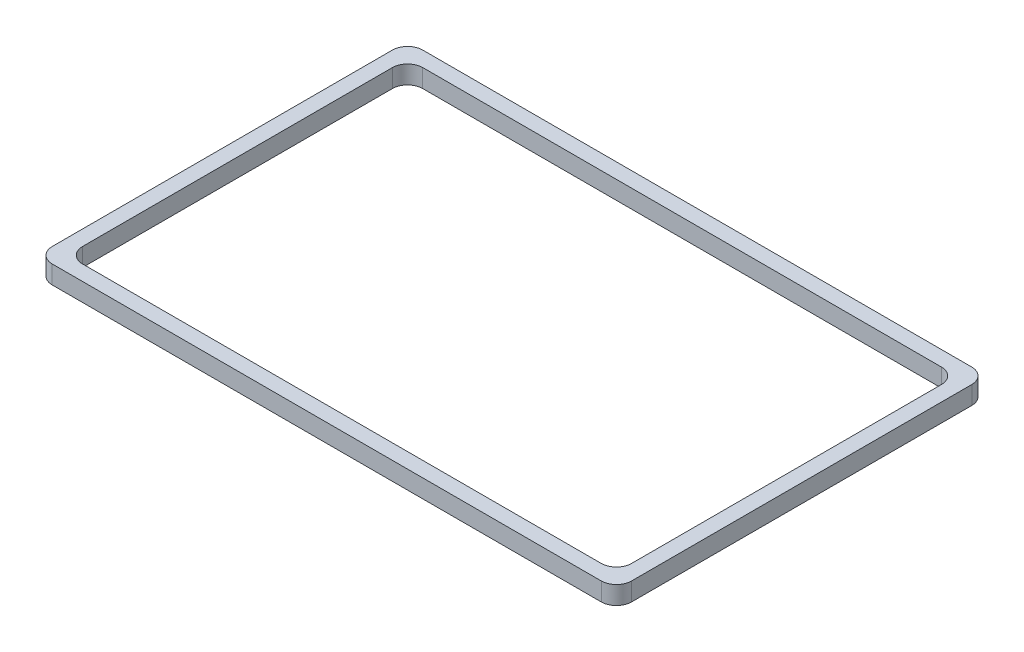
ISO-10303-21;
HEADER;
FILE_DESCRIPTION(('STEP AP214'),'2;1');
FILE_NAME('part.step','',(''),(''),'','','');
FILE_SCHEMA(('AUTOMOTIVE_DESIGN { 1 0 10303 214 1 1 1 1 }'));
ENDSEC;
DATA;
#1=APPLICATION_CONTEXT('core data for automotive mechanical design processes');
#2=APPLICATION_PROTOCOL_DEFINITION('international standard','automotive_design',2000,#1);
#3=PRODUCT_CONTEXT('',#1,'mechanical');
#4=PRODUCT('Part','Part','',(#3));
#5=PRODUCT_RELATED_PRODUCT_CATEGORY('part','',(#4));
#6=PRODUCT_DEFINITION_FORMATION('','',#4);
#7=PRODUCT_DEFINITION_CONTEXT('part definition',#1,'design');
#8=PRODUCT_DEFINITION('design','',#6,#7);
#9=PRODUCT_DEFINITION_SHAPE('','',#8);
#10=(LENGTH_UNIT() NAMED_UNIT(*) SI_UNIT(.MILLI.,.METRE.));
#11=(NAMED_UNIT(*) PLANE_ANGLE_UNIT() SI_UNIT($,.RADIAN.));
#12=(NAMED_UNIT(*) SI_UNIT($,.STERADIAN.) SOLID_ANGLE_UNIT());
#13=UNCERTAINTY_MEASURE_WITH_UNIT(LENGTH_MEASURE(1.E-05),#10,'distance_accuracy_value','');
#14=(GEOMETRIC_REPRESENTATION_CONTEXT(3) GLOBAL_UNCERTAINTY_ASSIGNED_CONTEXT((#13)) GLOBAL_UNIT_ASSIGNED_CONTEXT((#10,
#11,#12)) REPRESENTATION_CONTEXT('',''));
#15=CARTESIAN_POINT('',(0.,0.,0.));
#16=DIRECTION('',(0.,0.,1.));
#17=DIRECTION('',(1.,0.,0.));
#18=AXIS2_PLACEMENT_3D('',#15,#16,#17);
#19=CARTESIAN_POINT('',(-181.,12.,-112.15));
#20=DIRECTION('',(0.,1.,0.));
#21=DIRECTION('',(0.,0.,1.));
#22=AXIS2_PLACEMENT_3D('',#19,#20,#21);
#23=PLANE('',#22);
#24=CARTESIAN_POINT('',(-181.,12.,-112.15));
#25=DIRECTION('',(0.,1.,0.));
#26=DIRECTION('',(0.,0.,1.));
#27=AXIS2_PLACEMENT_3D('',#24,#25,#26);
#28=CIRCLE('',#27,10.);
#29=CARTESIAN_POINT('',(-181.,12.,-122.15));
#30=VERTEX_POINT('',#29);
#31=CARTESIAN_POINT('',(-191.,12.,-112.15));
#32=VERTEX_POINT('',#31);
#33=EDGE_CURVE('E242',#30,#32,#28,.T.);
#34=ORIENTED_EDGE('',*,*,#33,.T.);
#35=DIRECTION('',(0.,0.,1.));
#36=VECTOR('',#35,1.);
#37=CARTESIAN_POINT('',(-191.,12.,-112.15));
#38=LINE('',#37,#36);
#39=CARTESIAN_POINT('',(-191.,12.,112.15));
#40=VERTEX_POINT('',#39);
#41=EDGE_CURVE('E246',#32,#40,#38,.T.);
#42=ORIENTED_EDGE('',*,*,#41,.T.);
#43=CARTESIAN_POINT('',(-181.,12.,112.15));
#44=DIRECTION('',(0.,1.,0.));
#45=DIRECTION('',(0.,0.,1.));
#46=AXIS2_PLACEMENT_3D('',#43,#44,#45);
#47=CIRCLE('',#46,10.);
#48=CARTESIAN_POINT('',(-181.,12.,122.15));
#49=VERTEX_POINT('',#48);
#50=EDGE_CURVE('E250',#40,#49,#47,.T.);
#51=ORIENTED_EDGE('',*,*,#50,.T.);
#52=DIRECTION('',(1.,0.,0.));
#53=VECTOR('',#52,1.);
#54=CARTESIAN_POINT('',(-181.,12.,122.15));
#55=LINE('',#54,#53);
#56=CARTESIAN_POINT('',(181.,12.,122.15));
#57=VERTEX_POINT('',#56);
#58=EDGE_CURVE('E253',#49,#57,#55,.T.);
#59=ORIENTED_EDGE('',*,*,#58,.T.);
#60=CARTESIAN_POINT('',(181.,12.,112.15));
#61=DIRECTION('',(0.,1.,0.));
#62=DIRECTION('',(0.,0.,1.));
#63=AXIS2_PLACEMENT_3D('',#60,#61,#62);
#64=CIRCLE('',#63,10.);
#65=CARTESIAN_POINT('',(191.,12.,112.15));
#66=VERTEX_POINT('',#65);
#67=EDGE_CURVE('E256',#57,#66,#64,.T.);
#68=ORIENTED_EDGE('',*,*,#67,.T.);
#69=DIRECTION('',(0.,0.,-1.));
#70=VECTOR('',#69,1.);
#71=CARTESIAN_POINT('',(191.,12.,-112.15));
#72=LINE('',#71,#70);
#73=CARTESIAN_POINT('',(191.,12.,-112.15));
#74=VERTEX_POINT('',#73);
#75=EDGE_CURVE('E259',#66,#74,#72,.T.);
#76=ORIENTED_EDGE('',*,*,#75,.T.);
#77=CARTESIAN_POINT('',(181.,12.,-112.15));
#78=DIRECTION('',(0.,1.,0.));
#79=DIRECTION('',(0.,0.,-1.));
#80=AXIS2_PLACEMENT_3D('',#77,#78,#79);
#81=CIRCLE('',#80,10.);
#82=CARTESIAN_POINT('',(181.,12.,-122.15));
#83=VERTEX_POINT('',#82);
#84=EDGE_CURVE('E262',#74,#83,#81,.T.);
#85=ORIENTED_EDGE('',*,*,#84,.T.);
#86=DIRECTION('',(-1.,0.,0.));
#87=VECTOR('',#86,1.);
#88=CARTESIAN_POINT('',(-181.,12.,-122.15));
#89=LINE('',#88,#87);
#90=EDGE_CURVE('E265',#83,#30,#89,.T.);
#91=ORIENTED_EDGE('',*,*,#90,.T.);
#92=EDGE_LOOP('',(#34,#42,#51,#59,#68,#76,#85,#91));
#93=FACE_BOUND('',#92,.T.);
#94=DIRECTION('',(0.,0.,1.));
#95=VECTOR('',#94,1.);
#96=CARTESIAN_POINT('',(-181.,12.,-102.15));
#97=LINE('',#96,#95);
#98=CARTESIAN_POINT('',(-181.,12.,-102.15));
#99=VERTEX_POINT('',#98);
#100=CARTESIAN_POINT('',(-181.,12.,102.15));
#101=VERTEX_POINT('',#100);
#102=EDGE_CURVE('E162',#99,#101,#97,.T.);
#103=ORIENTED_EDGE('',*,*,#102,.F.);
#104=CARTESIAN_POINT('',(-171.,12.,-102.15));
#105=DIRECTION('',(0.,1.,0.));
#106=DIRECTION('',(0.,0.,1.));
#107=AXIS2_PLACEMENT_3D('',#104,#105,#106);
#108=CIRCLE('',#107,10.);
#109=CARTESIAN_POINT('',(-171.,12.,-112.15));
#110=VERTEX_POINT('',#109);
#111=EDGE_CURVE('E153',#110,#99,#108,.T.);
#112=ORIENTED_EDGE('',*,*,#111,.F.);
#113=DIRECTION('',(-1.,0.,0.));
#114=VECTOR('',#113,1.);
#115=CARTESIAN_POINT('',(-171.,12.,-112.15));
#116=LINE('',#115,#114);
#117=CARTESIAN_POINT('',(171.,12.,-112.15));
#118=VERTEX_POINT('',#117);
#119=EDGE_CURVE('E194',#118,#110,#116,.T.);
#120=ORIENTED_EDGE('',*,*,#119,.F.);
#121=CARTESIAN_POINT('',(171.,12.,-102.15));
#122=DIRECTION('',(0.,1.,0.));
#123=DIRECTION('',(0.,0.,-1.));
#124=AXIS2_PLACEMENT_3D('',#121,#122,#123);
#125=CIRCLE('',#124,10.);
#126=CARTESIAN_POINT('',(181.,12.,-102.15));
#127=VERTEX_POINT('',#126);
#128=EDGE_CURVE('E191',#127,#118,#125,.T.);
#129=ORIENTED_EDGE('',*,*,#128,.F.);
#130=DIRECTION('',(0.,0.,-1.));
#131=VECTOR('',#130,1.);
#132=CARTESIAN_POINT('',(181.,12.,-102.15));
#133=LINE('',#132,#131);
#134=CARTESIAN_POINT('',(181.,12.,102.15));
#135=VERTEX_POINT('',#134);
#136=EDGE_CURVE('E188',#135,#127,#133,.T.);
#137=ORIENTED_EDGE('',*,*,#136,.F.);
#138=CARTESIAN_POINT('',(171.,12.,102.15));
#139=DIRECTION('',(0.,1.,0.));
#140=DIRECTION('',(0.,0.,1.));
#141=AXIS2_PLACEMENT_3D('',#138,#139,#140);
#142=CIRCLE('',#141,10.);
#143=CARTESIAN_POINT('',(171.,12.,112.15));
#144=VERTEX_POINT('',#143);
#145=EDGE_CURVE('E185',#144,#135,#142,.T.);
#146=ORIENTED_EDGE('',*,*,#145,.F.);
#147=DIRECTION('',(1.,0.,0.));
#148=VECTOR('',#147,1.);
#149=CARTESIAN_POINT('',(-171.,12.,112.15));
#150=LINE('',#149,#148);
#151=CARTESIAN_POINT('',(-171.,12.,112.15));
#152=VERTEX_POINT('',#151);
#153=EDGE_CURVE('E180',#152,#144,#150,.T.);
#154=ORIENTED_EDGE('',*,*,#153,.F.);
#155=CARTESIAN_POINT('',(-171.,12.,102.15));
#156=DIRECTION('',(0.,1.,0.));
#157=DIRECTION('',(0.,0.,1.));
#158=AXIS2_PLACEMENT_3D('',#155,#156,#157);
#159=CIRCLE('',#158,10.);
#160=EDGE_CURVE('E176',#101,#152,#159,.T.);
#161=ORIENTED_EDGE('',*,*,#160,.F.);
#162=EDGE_LOOP('',(#103,#112,#120,#129,#137,#146,#154,#161));
#163=FACE_BOUND('',#162,.T.);
#164=ADVANCED_FACE('F39',(#93,#163),#23,.T.);
#165=CARTESIAN_POINT('',(-181.,0.,-112.15));
#166=DIRECTION('',(0.,1.,0.));
#167=DIRECTION('',(0.,0.,1.));
#168=AXIS2_PLACEMENT_3D('',#165,#166,#167);
#169=PLANE('',#168);
#170=CARTESIAN_POINT('',(-181.,0.,-112.15));
#171=DIRECTION('',(0.,1.,0.));
#172=DIRECTION('',(0.,0.,1.));
#173=AXIS2_PLACEMENT_3D('',#170,#171,#172);
#174=CIRCLE('',#173,10.);
#175=CARTESIAN_POINT('',(-181.,0.,-122.15));
#176=VERTEX_POINT('',#175);
#177=CARTESIAN_POINT('',(-191.,0.,-112.15));
#178=VERTEX_POINT('',#177);
#179=EDGE_CURVE('E171',#176,#178,#174,.T.);
#180=ORIENTED_EDGE('',*,*,#179,.F.);
#181=DIRECTION('',(-1.,0.,0.));
#182=VECTOR('',#181,1.);
#183=CARTESIAN_POINT('',(-181.,0.,-122.15));
#184=LINE('',#183,#182);
#185=CARTESIAN_POINT('',(181.,0.,-122.15));
#186=VERTEX_POINT('',#185);
#187=EDGE_CURVE('E247',#186,#176,#184,.T.);
#188=ORIENTED_EDGE('',*,*,#187,.F.);
#189=CARTESIAN_POINT('',(181.,0.,-112.15));
#190=DIRECTION('',(0.,1.,0.));
#191=DIRECTION('',(0.,0.,-1.));
#192=AXIS2_PLACEMENT_3D('',#189,#190,#191);
#193=CIRCLE('',#192,10.);
#194=CARTESIAN_POINT('',(191.,0.,-112.15));
#195=VERTEX_POINT('',#194);
#196=EDGE_CURVE('E287',#195,#186,#193,.T.);
#197=ORIENTED_EDGE('',*,*,#196,.F.);
#198=DIRECTION('',(0.,0.,-1.));
#199=VECTOR('',#198,1.);
#200=CARTESIAN_POINT('',(191.,0.,-112.15));
#201=LINE('',#200,#199);
#202=CARTESIAN_POINT('',(191.,0.,112.15));
#203=VERTEX_POINT('',#202);
#204=EDGE_CURVE('E284',#203,#195,#201,.T.);
#205=ORIENTED_EDGE('',*,*,#204,.F.);
#206=CARTESIAN_POINT('',(181.,0.,112.15));
#207=DIRECTION('',(0.,1.,0.));
#208=DIRECTION('',(0.,0.,1.));
#209=AXIS2_PLACEMENT_3D('',#206,#207,#208);
#210=CIRCLE('',#209,10.);
#211=CARTESIAN_POINT('',(181.,0.,122.15));
#212=VERTEX_POINT('',#211);
#213=EDGE_CURVE('E281',#212,#203,#210,.T.);
#214=ORIENTED_EDGE('',*,*,#213,.F.);
#215=DIRECTION('',(1.,0.,0.));
#216=VECTOR('',#215,1.);
#217=CARTESIAN_POINT('',(-181.,0.,122.15));
#218=LINE('',#217,#216);
#219=CARTESIAN_POINT('',(-181.,0.,122.15));
#220=VERTEX_POINT('',#219);
#221=EDGE_CURVE('E278',#220,#212,#218,.T.);
#222=ORIENTED_EDGE('',*,*,#221,.F.);
#223=CARTESIAN_POINT('',(-181.,0.,112.15));
#224=DIRECTION('',(0.,1.,0.));
#225=DIRECTION('',(0.,0.,1.));
#226=AXIS2_PLACEMENT_3D('',#223,#224,#225);
#227=CIRCLE('',#226,10.);
#228=CARTESIAN_POINT('',(-191.,0.,112.15));
#229=VERTEX_POINT('',#228);
#230=EDGE_CURVE('E275',#229,#220,#227,.T.);
#231=ORIENTED_EDGE('',*,*,#230,.F.);
#232=DIRECTION('',(0.,0.,1.));
#233=VECTOR('',#232,1.);
#234=CARTESIAN_POINT('',(-191.,0.,-112.15));
#235=LINE('',#234,#233);
#236=EDGE_CURVE('E272',#178,#229,#235,.T.);
#237=ORIENTED_EDGE('',*,*,#236,.F.);
#238=EDGE_LOOP('',(#180,#188,#197,#205,#214,#222,#231,#237));
#239=FACE_BOUND('',#238,.T.);
#240=CARTESIAN_POINT('',(-171.,0.,-102.15));
#241=DIRECTION('',(0.,1.,0.));
#242=DIRECTION('',(0.,0.,1.));
#243=AXIS2_PLACEMENT_3D('',#240,#241,#242);
#244=CIRCLE('',#243,10.);
#245=CARTESIAN_POINT('',(-171.,0.,-112.15));
#246=VERTEX_POINT('',#245);
#247=CARTESIAN_POINT('',(-181.,0.,-102.15));
#248=VERTEX_POINT('',#247);
#249=EDGE_CURVE('E63',#246,#248,#244,.T.);
#250=ORIENTED_EDGE('',*,*,#249,.T.);
#251=DIRECTION('',(0.,0.,1.));
#252=VECTOR('',#251,1.);
#253=CARTESIAN_POINT('',(-181.,0.,-102.15));
#254=LINE('',#253,#252);
#255=CARTESIAN_POINT('',(-181.,0.,102.15));
#256=VERTEX_POINT('',#255);
#257=EDGE_CURVE('E169',#248,#256,#254,.T.);
#258=ORIENTED_EDGE('',*,*,#257,.T.);
#259=CARTESIAN_POINT('',(-171.,0.,102.15));
#260=DIRECTION('',(0.,1.,0.));
#261=DIRECTION('',(0.,0.,1.));
#262=AXIS2_PLACEMENT_3D('',#259,#260,#261);
#263=CIRCLE('',#262,10.);
#264=CARTESIAN_POINT('',(-171.,0.,112.15));
#265=VERTEX_POINT('',#264);
#266=EDGE_CURVE('E201',#256,#265,#263,.T.);
#267=ORIENTED_EDGE('',*,*,#266,.T.);
#268=DIRECTION('',(1.,0.,0.));
#269=VECTOR('',#268,1.);
#270=CARTESIAN_POINT('',(-171.,0.,112.15));
#271=LINE('',#270,#269);
#272=CARTESIAN_POINT('',(171.,0.,112.15));
#273=VERTEX_POINT('',#272);
#274=EDGE_CURVE('E205',#265,#273,#271,.T.);
#275=ORIENTED_EDGE('',*,*,#274,.T.);
#276=CARTESIAN_POINT('',(171.,0.,102.15));
#277=DIRECTION('',(0.,1.,0.));
#278=DIRECTION('',(0.,0.,1.));
#279=AXIS2_PLACEMENT_3D('',#276,#277,#278);
#280=CIRCLE('',#279,10.);
#281=CARTESIAN_POINT('',(181.,0.,102.15));
#282=VERTEX_POINT('',#281);
#283=EDGE_CURVE('E209',#273,#282,#280,.T.);
#284=ORIENTED_EDGE('',*,*,#283,.T.);
#285=DIRECTION('',(0.,0.,-1.));
#286=VECTOR('',#285,1.);
#287=CARTESIAN_POINT('',(181.,0.,-102.15));
#288=LINE('',#287,#286);
#289=CARTESIAN_POINT('',(181.,0.,-102.15));
#290=VERTEX_POINT('',#289);
#291=EDGE_CURVE('E213',#282,#290,#288,.T.);
#292=ORIENTED_EDGE('',*,*,#291,.T.);
#293=CARTESIAN_POINT('',(171.,0.,-102.15));
#294=DIRECTION('',(0.,1.,0.));
#295=DIRECTION('',(0.,0.,-1.));
#296=AXIS2_PLACEMENT_3D('',#293,#294,#295);
#297=CIRCLE('',#296,10.);
#298=CARTESIAN_POINT('',(171.,0.,-112.15));
#299=VERTEX_POINT('',#298);
#300=EDGE_CURVE('E217',#290,#299,#297,.T.);
#301=ORIENTED_EDGE('',*,*,#300,.T.);
#302=DIRECTION('',(-1.,0.,0.));
#303=VECTOR('',#302,1.);
#304=CARTESIAN_POINT('',(-171.,0.,-112.15));
#305=LINE('',#304,#303);
#306=EDGE_CURVE('E163',#299,#246,#305,.T.);
#307=ORIENTED_EDGE('',*,*,#306,.T.);
#308=EDGE_LOOP('',(#250,#258,#267,#275,#284,#292,#301,#307));
#309=FACE_BOUND('',#308,.T.);
#310=ADVANCED_FACE('F326',(#239,#309),#169,.F.);
#311=CARTESIAN_POINT('',(-181.,12.,-112.15));
#312=DIRECTION('',(0.,-1.,0.));
#313=DIRECTION('',(0.,0.,-1.));
#314=AXIS2_PLACEMENT_3D('',#311,#312,#313);
#315=CYLINDRICAL_SURFACE('',#314,10.);
#316=ORIENTED_EDGE('',*,*,#179,.T.);
#317=DIRECTION('',(0.,-1.,0.));
#318=VECTOR('',#317,1.);
#319=CARTESIAN_POINT('',(-191.,12.,-112.15));
#320=LINE('',#319,#318);
#321=EDGE_CURVE('E11',#32,#178,#320,.T.);
#322=ORIENTED_EDGE('',*,*,#321,.F.);
#323=ORIENTED_EDGE('',*,*,#33,.F.);
#324=DIRECTION('',(0.,-1.,0.));
#325=VECTOR('',#324,1.);
#326=CARTESIAN_POINT('',(-181.,12.,-122.15));
#327=LINE('',#326,#325);
#328=EDGE_CURVE('E268',#30,#176,#327,.T.);
#329=ORIENTED_EDGE('',*,*,#328,.T.);
#330=EDGE_LOOP('',(#316,#322,#323,#329));
#331=FACE_BOUND('',#330,.T.);
#332=ADVANCED_FACE('F41',(#331),#315,.T.);
#333=CARTESIAN_POINT('',(-191.,12.,-112.15));
#334=DIRECTION('',(1.,0.,0.));
#335=DIRECTION('',(0.,0.,-1.));
#336=AXIS2_PLACEMENT_3D('',#333,#334,#335);
#337=PLANE('',#336);
#338=ORIENTED_EDGE('',*,*,#236,.T.);
#339=DIRECTION('',(0.,-1.,0.));
#340=VECTOR('',#339,1.);
#341=CARTESIAN_POINT('',(-191.,12.,112.15));
#342=LINE('',#341,#340);
#343=EDGE_CURVE('E48',#40,#229,#342,.T.);
#344=ORIENTED_EDGE('',*,*,#343,.F.);
#345=ORIENTED_EDGE('',*,*,#41,.F.);
#346=ORIENTED_EDGE('',*,*,#321,.T.);
#347=EDGE_LOOP('',(#338,#344,#345,#346));
#348=FACE_BOUND('',#347,.T.);
#349=ADVANCED_FACE('F343',(#348),#337,.F.);
#350=CARTESIAN_POINT('',(-181.,12.,112.15));
#351=DIRECTION('',(0.,-1.,0.));
#352=DIRECTION('',(0.,0.,-1.));
#353=AXIS2_PLACEMENT_3D('',#350,#351,#352);
#354=CYLINDRICAL_SURFACE('',#353,10.);
#355=ORIENTED_EDGE('',*,*,#230,.T.);
#356=DIRECTION('',(0.,-1.,0.));
#357=VECTOR('',#356,1.);
#358=CARTESIAN_POINT('',(-181.,12.,122.15));
#359=LINE('',#358,#357);
#360=EDGE_CURVE('E311',#49,#220,#359,.T.);
#361=ORIENTED_EDGE('',*,*,#360,.F.);
#362=ORIENTED_EDGE('',*,*,#50,.F.);
#363=ORIENTED_EDGE('',*,*,#343,.T.);
#364=EDGE_LOOP('',(#355,#361,#362,#363));
#365=FACE_BOUND('',#364,.T.);
#366=ADVANCED_FACE('F320',(#365),#354,.T.);
#367=CARTESIAN_POINT('',(-181.,12.,122.15));
#368=DIRECTION('',(0.,0.,-1.));
#369=DIRECTION('',(-1.,0.,0.));
#370=AXIS2_PLACEMENT_3D('',#367,#368,#369);
#371=PLANE('',#370);
#372=ORIENTED_EDGE('',*,*,#221,.T.);
#373=DIRECTION('',(0.,-1.,0.));
#374=VECTOR('',#373,1.);
#375=CARTESIAN_POINT('',(181.,12.,122.15));
#376=LINE('',#375,#374);
#377=EDGE_CURVE('E307',#57,#212,#376,.T.);
#378=ORIENTED_EDGE('',*,*,#377,.F.);
#379=ORIENTED_EDGE('',*,*,#58,.F.);
#380=ORIENTED_EDGE('',*,*,#360,.T.);
#381=EDGE_LOOP('',(#372,#378,#379,#380));
#382=FACE_BOUND('',#381,.T.);
#383=ADVANCED_FACE('F332',(#382),#371,.F.);
#384=CARTESIAN_POINT('',(181.,12.,112.15));
#385=DIRECTION('',(0.,-1.,0.));
#386=DIRECTION('',(0.,0.,-1.));
#387=AXIS2_PLACEMENT_3D('',#384,#385,#386);
#388=CYLINDRICAL_SURFACE('',#387,10.);
#389=ORIENTED_EDGE('',*,*,#213,.T.);
#390=DIRECTION('',(0.,-1.,0.));
#391=VECTOR('',#390,1.);
#392=CARTESIAN_POINT('',(191.,12.,112.15));
#393=LINE('',#392,#391);
#394=EDGE_CURVE('E303',#66,#203,#393,.T.);
#395=ORIENTED_EDGE('',*,*,#394,.F.);
#396=ORIENTED_EDGE('',*,*,#67,.F.);
#397=ORIENTED_EDGE('',*,*,#377,.T.);
#398=EDGE_LOOP('',(#389,#395,#396,#397));
#399=FACE_BOUND('',#398,.T.);
#400=ADVANCED_FACE('F336',(#399),#388,.T.);
#401=CARTESIAN_POINT('',(191.,12.,-112.15));
#402=DIRECTION('',(-1.,0.,0.));
#403=DIRECTION('',(0.,0.,1.));
#404=AXIS2_PLACEMENT_3D('',#401,#402,#403);
#405=PLANE('',#404);
#406=ORIENTED_EDGE('',*,*,#204,.T.);
#407=DIRECTION('',(0.,-1.,0.));
#408=VECTOR('',#407,1.);
#409=CARTESIAN_POINT('',(191.,12.,-112.15));
#410=LINE('',#409,#408);
#411=EDGE_CURVE('E299',#74,#195,#410,.T.);
#412=ORIENTED_EDGE('',*,*,#411,.F.);
#413=ORIENTED_EDGE('',*,*,#75,.F.);
#414=ORIENTED_EDGE('',*,*,#394,.T.);
#415=EDGE_LOOP('',(#406,#412,#413,#414));
#416=FACE_BOUND('',#415,.T.);
#417=ADVANCED_FACE('F356',(#416),#405,.F.);
#418=CARTESIAN_POINT('',(181.,12.,-112.15));
#419=DIRECTION('',(0.,-1.,0.));
#420=DIRECTION('',(0.,0.,-1.));
#421=AXIS2_PLACEMENT_3D('',#418,#419,#420);
#422=CYLINDRICAL_SURFACE('',#421,10.);
#423=ORIENTED_EDGE('',*,*,#196,.T.);
#424=DIRECTION('',(0.,-1.,0.));
#425=VECTOR('',#424,1.);
#426=CARTESIAN_POINT('',(181.,12.,-122.15));
#427=LINE('',#426,#425);
#428=EDGE_CURVE('E295',#83,#186,#427,.T.);
#429=ORIENTED_EDGE('',*,*,#428,.F.);
#430=ORIENTED_EDGE('',*,*,#84,.F.);
#431=ORIENTED_EDGE('',*,*,#411,.T.);
#432=EDGE_LOOP('',(#423,#429,#430,#431));
#433=FACE_BOUND('',#432,.T.);
#434=ADVANCED_FACE('F354',(#433),#422,.T.);
#435=CARTESIAN_POINT('',(-181.,12.,-122.15));
#436=DIRECTION('',(0.,0.,1.));
#437=DIRECTION('',(1.,0.,0.));
#438=AXIS2_PLACEMENT_3D('',#435,#436,#437);
#439=PLANE('',#438);
#440=ORIENTED_EDGE('',*,*,#187,.T.);
#441=ORIENTED_EDGE('',*,*,#328,.F.);
#442=ORIENTED_EDGE('',*,*,#90,.F.);
#443=ORIENTED_EDGE('',*,*,#428,.T.);
#444=EDGE_LOOP('',(#440,#441,#442,#443));
#445=FACE_BOUND('',#444,.T.);
#446=ADVANCED_FACE('F349',(#445),#439,.F.);
#447=CARTESIAN_POINT('',(-171.,12.,-102.15));
#448=DIRECTION('',(0.,-1.,0.));
#449=DIRECTION('',(0.,0.,-1.));
#450=AXIS2_PLACEMENT_3D('',#447,#448,#449);
#451=CYLINDRICAL_SURFACE('',#450,10.);
#452=ORIENTED_EDGE('',*,*,#249,.F.);
#453=DIRECTION('',(0.,-1.,0.));
#454=VECTOR('',#453,1.);
#455=CARTESIAN_POINT('',(-171.,12.,-112.15));
#456=LINE('',#455,#454);
#457=EDGE_CURVE('E157',#110,#246,#456,.T.);
#458=ORIENTED_EDGE('',*,*,#457,.F.);
#459=ORIENTED_EDGE('',*,*,#111,.T.);
#460=DIRECTION('',(0.,-1.,0.));
#461=VECTOR('',#460,1.);
#462=CARTESIAN_POINT('',(-181.,12.,-102.15));
#463=LINE('',#462,#461);
#464=EDGE_CURVE('E156',#99,#248,#463,.T.);
#465=ORIENTED_EDGE('',*,*,#464,.T.);
#466=EDGE_LOOP('',(#452,#458,#459,#465));
#467=FACE_BOUND('',#466,.T.);
#468=ADVANCED_FACE('F155',(#467),#451,.F.);
#469=CARTESIAN_POINT('',(-181.,12.,-102.15));
#470=DIRECTION('',(1.,0.,0.));
#471=DIRECTION('',(0.,0.,-1.));
#472=AXIS2_PLACEMENT_3D('',#469,#470,#471);
#473=PLANE('',#472);
#474=ORIENTED_EDGE('',*,*,#257,.F.);
#475=ORIENTED_EDGE('',*,*,#464,.F.);
#476=ORIENTED_EDGE('',*,*,#102,.T.);
#477=DIRECTION('',(0.,-1.,0.));
#478=VECTOR('',#477,1.);
#479=CARTESIAN_POINT('',(-181.,12.,102.15));
#480=LINE('',#479,#478);
#481=EDGE_CURVE('E172',#101,#256,#480,.T.);
#482=ORIENTED_EDGE('',*,*,#481,.T.);
#483=EDGE_LOOP('',(#474,#475,#476,#482));
#484=FACE_BOUND('',#483,.T.);
#485=ADVANCED_FACE('F166',(#484),#473,.T.);
#486=CARTESIAN_POINT('',(-171.,12.,102.15));
#487=DIRECTION('',(0.,-1.,0.));
#488=DIRECTION('',(0.,0.,-1.));
#489=AXIS2_PLACEMENT_3D('',#486,#487,#488);
#490=CYLINDRICAL_SURFACE('',#489,10.);
#491=ORIENTED_EDGE('',*,*,#266,.F.);
#492=ORIENTED_EDGE('',*,*,#481,.F.);
#493=ORIENTED_EDGE('',*,*,#160,.T.);
#494=DIRECTION('',(0.,-1.,0.));
#495=VECTOR('',#494,1.);
#496=CARTESIAN_POINT('',(-171.,12.,112.15));
#497=LINE('',#496,#495);
#498=EDGE_CURVE('E237',#152,#265,#497,.T.);
#499=ORIENTED_EDGE('',*,*,#498,.T.);
#500=EDGE_LOOP('',(#491,#492,#493,#499));
#501=FACE_BOUND('',#500,.T.);
#502=ADVANCED_FACE('F381',(#501),#490,.F.);
#503=CARTESIAN_POINT('',(-171.,12.,112.15));
#504=DIRECTION('',(0.,0.,-1.));
#505=DIRECTION('',(-1.,0.,0.));
#506=AXIS2_PLACEMENT_3D('',#503,#504,#505);
#507=PLANE('',#506);
#508=ORIENTED_EDGE('',*,*,#274,.F.);
#509=ORIENTED_EDGE('',*,*,#498,.F.);
#510=ORIENTED_EDGE('',*,*,#153,.T.);
#511=DIRECTION('',(0.,-1.,0.));
#512=VECTOR('',#511,1.);
#513=CARTESIAN_POINT('',(171.,12.,112.15));
#514=LINE('',#513,#512);
#515=EDGE_CURVE('E234',#144,#273,#514,.T.);
#516=ORIENTED_EDGE('',*,*,#515,.T.);
#517=EDGE_LOOP('',(#508,#509,#510,#516));
#518=FACE_BOUND('',#517,.T.);
#519=ADVANCED_FACE('F385',(#518),#507,.T.);
#520=CARTESIAN_POINT('',(171.,12.,102.15));
#521=DIRECTION('',(0.,-1.,0.));
#522=DIRECTION('',(0.,0.,-1.));
#523=AXIS2_PLACEMENT_3D('',#520,#521,#522);
#524=CYLINDRICAL_SURFACE('',#523,10.);
#525=ORIENTED_EDGE('',*,*,#283,.F.);
#526=ORIENTED_EDGE('',*,*,#515,.F.);
#527=ORIENTED_EDGE('',*,*,#145,.T.);
#528=DIRECTION('',(0.,-1.,0.));
#529=VECTOR('',#528,1.);
#530=CARTESIAN_POINT('',(181.,12.,102.15));
#531=LINE('',#530,#529);
#532=EDGE_CURVE('E231',#135,#282,#531,.T.);
#533=ORIENTED_EDGE('',*,*,#532,.T.);
#534=EDGE_LOOP('',(#525,#526,#527,#533));
#535=FACE_BOUND('',#534,.T.);
#536=ADVANCED_FACE('F391',(#535),#524,.F.);
#537=CARTESIAN_POINT('',(181.,12.,-102.15));
#538=DIRECTION('',(-1.,0.,0.));
#539=DIRECTION('',(0.,0.,1.));
#540=AXIS2_PLACEMENT_3D('',#537,#538,#539);
#541=PLANE('',#540);
#542=ORIENTED_EDGE('',*,*,#291,.F.);
#543=ORIENTED_EDGE('',*,*,#532,.F.);
#544=ORIENTED_EDGE('',*,*,#136,.T.);
#545=DIRECTION('',(0.,-1.,0.));
#546=VECTOR('',#545,1.);
#547=CARTESIAN_POINT('',(181.,12.,-102.15));
#548=LINE('',#547,#546);
#549=EDGE_CURVE('E228',#127,#290,#548,.T.);
#550=ORIENTED_EDGE('',*,*,#549,.T.);
#551=EDGE_LOOP('',(#542,#543,#544,#550));
#552=FACE_BOUND('',#551,.T.);
#553=ADVANCED_FACE('F395',(#552),#541,.T.);
#554=CARTESIAN_POINT('',(171.,12.,-102.15));
#555=DIRECTION('',(0.,-1.,0.));
#556=DIRECTION('',(0.,0.,-1.));
#557=AXIS2_PLACEMENT_3D('',#554,#555,#556);
#558=CYLINDRICAL_SURFACE('',#557,10.);
#559=ORIENTED_EDGE('',*,*,#300,.F.);
#560=ORIENTED_EDGE('',*,*,#549,.F.);
#561=ORIENTED_EDGE('',*,*,#128,.T.);
#562=DIRECTION('',(0.,-1.,0.));
#563=VECTOR('',#562,1.);
#564=CARTESIAN_POINT('',(171.,12.,-112.15));
#565=LINE('',#564,#563);
#566=EDGE_CURVE('E55',#118,#299,#565,.T.);
#567=ORIENTED_EDGE('',*,*,#566,.T.);
#568=EDGE_LOOP('',(#559,#560,#561,#567));
#569=FACE_BOUND('',#568,.T.);
#570=ADVANCED_FACE('F399',(#569),#558,.F.);
#571=CARTESIAN_POINT('',(-171.,12.,-112.15));
#572=DIRECTION('',(0.,0.,1.));
#573=DIRECTION('',(1.,0.,0.));
#574=AXIS2_PLACEMENT_3D('',#571,#572,#573);
#575=PLANE('',#574);
#576=ORIENTED_EDGE('',*,*,#306,.F.);
#577=ORIENTED_EDGE('',*,*,#566,.F.);
#578=ORIENTED_EDGE('',*,*,#119,.T.);
#579=ORIENTED_EDGE('',*,*,#457,.T.);
#580=EDGE_LOOP('',(#576,#577,#578,#579));
#581=FACE_BOUND('',#580,.T.);
#582=ADVANCED_FACE('F403',(#581),#575,.T.);
#583=CLOSED_SHELL('',(#164,#310,#332,#349,#366,#383,#400,#417,#434,#446,#468,#485,#502,#519,
#536,#553,#570,#582));
#584=MANIFOLD_SOLID_BREP('B2',#583);
#585=ADVANCED_BREP_SHAPE_REPRESENTATION('',(#18,#584),#14);
#586=SHAPE_DEFINITION_REPRESENTATION(#9,#585);
ENDSEC;
END-ISO-10303-21;
